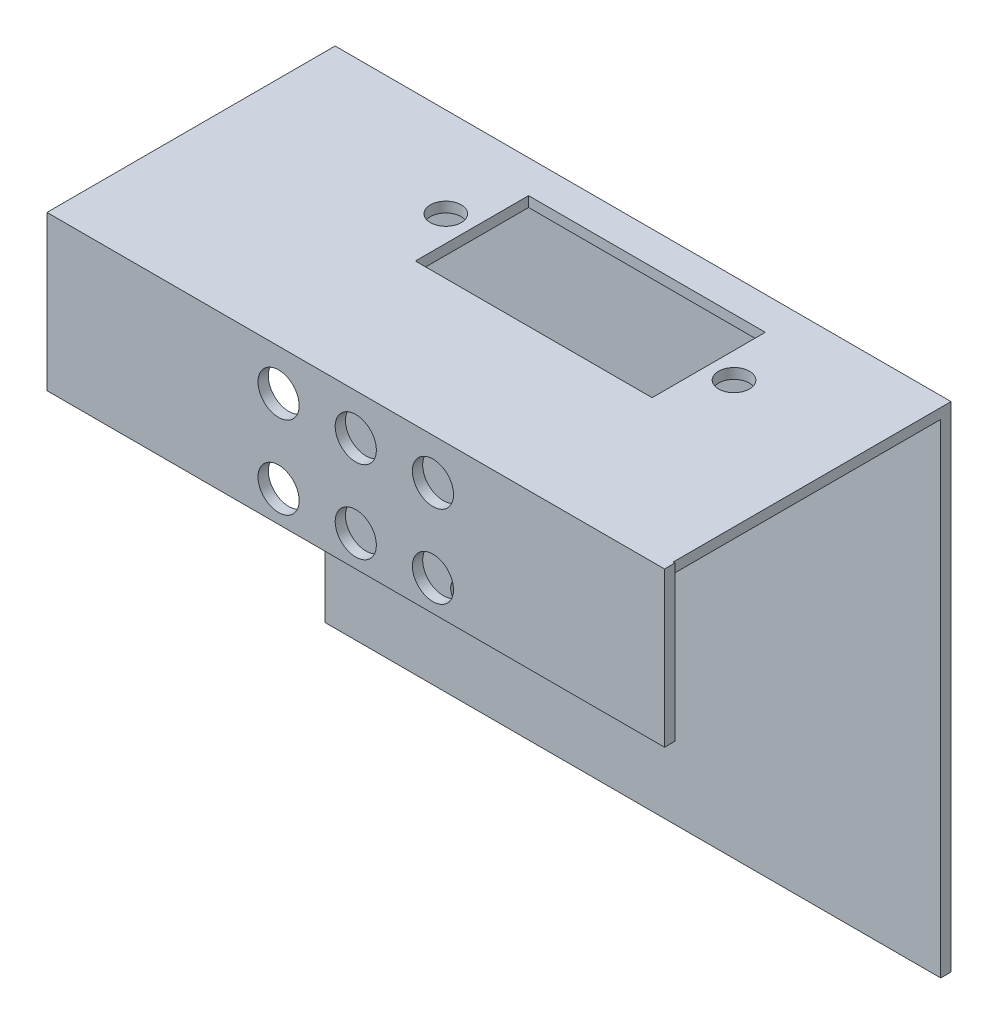
ISO-10303-21;
HEADER;
FILE_DESCRIPTION(('STEP AP214'),'2;1');
FILE_NAME('part.step','',(''),(''),'','','');
FILE_SCHEMA(('AUTOMOTIVE_DESIGN { 1 0 10303 214 1 1 1 1 }'));
ENDSEC;
DATA;
#1=APPLICATION_CONTEXT('core data for automotive mechanical design processes');
#2=APPLICATION_PROTOCOL_DEFINITION('international standard','automotive_design',2000,#1);
#3=PRODUCT_CONTEXT('',#1,'mechanical');
#4=PRODUCT('Part','Part','',(#3));
#5=PRODUCT_RELATED_PRODUCT_CATEGORY('part','',(#4));
#6=PRODUCT_DEFINITION_FORMATION('','',#4);
#7=PRODUCT_DEFINITION_CONTEXT('part definition',#1,'design');
#8=PRODUCT_DEFINITION('design','',#6,#7);
#9=PRODUCT_DEFINITION_SHAPE('','',#8);
#10=(LENGTH_UNIT() NAMED_UNIT(*) SI_UNIT(.MILLI.,.METRE.));
#11=(NAMED_UNIT(*) PLANE_ANGLE_UNIT() SI_UNIT($,.RADIAN.));
#12=(NAMED_UNIT(*) SI_UNIT($,.STERADIAN.) SOLID_ANGLE_UNIT());
#13=UNCERTAINTY_MEASURE_WITH_UNIT(LENGTH_MEASURE(1.E-05),#10,'distance_accuracy_value','');
#14=(GEOMETRIC_REPRESENTATION_CONTEXT(3) GLOBAL_UNCERTAINTY_ASSIGNED_CONTEXT((#13)) GLOBAL_UNIT_ASSIGNED_CONTEXT((#10,
#11,#12)) REPRESENTATION_CONTEXT('',''));
#15=CARTESIAN_POINT('',(0.,0.,0.));
#16=DIRECTION('',(0.,0.,1.));
#17=DIRECTION('',(1.,0.,0.));
#18=AXIS2_PLACEMENT_3D('',#15,#16,#17);
#19=CARTESIAN_POINT('',(0.,0.,0.));
#20=DIRECTION('',(0.,0.,-1.));
#21=DIRECTION('',(-1.,0.,0.));
#22=AXIS2_PLACEMENT_3D('',#19,#20,#21);
#23=PLANE('',#22);
#24=CARTESIAN_POINT('',(0.,-4.50000000000001,0.));
#25=DIRECTION('',(0.,0.,-1.));
#26=DIRECTION('',(-1.,0.,0.));
#27=AXIS2_PLACEMENT_3D('',#24,#25,#26);
#28=CIRCLE('',#27,2.);
#29=CARTESIAN_POINT('',(-1.99999999999998,-4.50000000000001,0.));
#30=VERTEX_POINT('',#29);
#31=EDGE_CURVE('E208',#30,#30,#28,.T.);
#32=ORIENTED_EDGE('',*,*,#31,.F.);
#33=EDGE_LOOP('',(#32));
#34=FACE_BOUND('',#33,.T.);
#35=DIRECTION('',(0.,-1.,0.));
#36=VECTOR('',#35,1.);
#37=CARTESIAN_POINT('',(-30.,7.49999999999998,0.));
#38=LINE('',#37,#36);
#39=CARTESIAN_POINT('',(-30.,6.5,0.));
#40=VERTEX_POINT('',#39);
#41=CARTESIAN_POINT('',(-30.,-7.50000000000001,0.));
#42=VERTEX_POINT('',#41);
#43=EDGE_CURVE('E260',#40,#42,#38,.T.);
#44=ORIENTED_EDGE('',*,*,#43,.F.);
#45=DIRECTION('',(1.,0.,0.));
#46=VECTOR('',#45,1.);
#47=CARTESIAN_POINT('',(-30.0040434778772,6.5,0.));
#48=LINE('',#47,#46);
#49=CARTESIAN_POINT('',(29.8328247305026,6.5,0.));
#50=VERTEX_POINT('',#49);
#51=EDGE_CURVE('E11',#40,#50,#48,.T.);
#52=ORIENTED_EDGE('',*,*,#51,.T.);
#53=DIRECTION('',(0.,1.,0.));
#54=VECTOR('',#53,1.);
#55=CARTESIAN_POINT('',(29.8328247305026,6.5,0.));
#56=LINE('',#55,#54);
#57=CARTESIAN_POINT('',(29.8328247305026,7.5,0.));
#58=VERTEX_POINT('',#57);
#59=EDGE_CURVE('E247',#50,#58,#56,.T.);
#60=ORIENTED_EDGE('',*,*,#59,.T.);
#61=DIRECTION('',(-1.,0.,0.));
#62=VECTOR('',#61,1.);
#63=CARTESIAN_POINT('',(30.,7.5,0.));
#64=LINE('',#63,#62);
#65=CARTESIAN_POINT('',(30.,7.5,0.));
#66=VERTEX_POINT('',#65);
#67=EDGE_CURVE('E271',#66,#58,#64,.T.);
#68=ORIENTED_EDGE('',*,*,#67,.F.);
#69=DIRECTION('',(0.,1.,0.));
#70=VECTOR('',#69,1.);
#71=CARTESIAN_POINT('',(30.,7.5,0.));
#72=LINE('',#71,#70);
#73=CARTESIAN_POINT('',(30.,-7.5,0.));
#74=VERTEX_POINT('',#73);
#75=EDGE_CURVE('E283',#74,#66,#72,.T.);
#76=ORIENTED_EDGE('',*,*,#75,.F.);
#77=DIRECTION('',(1.,0.,0.));
#78=VECTOR('',#77,1.);
#79=CARTESIAN_POINT('',(30.,-7.5,0.));
#80=LINE('',#79,#78);
#81=EDGE_CURVE('E281',#42,#74,#80,.T.);
#82=ORIENTED_EDGE('',*,*,#81,.F.);
#83=EDGE_LOOP('',(#44,#52,#60,#68,#76,#82));
#84=FACE_BOUND('',#83,.T.);
#85=CARTESIAN_POINT('',(-7.49999999999998,3.50000000000001,0.));
#86=DIRECTION('',(0.,0.,1.));
#87=DIRECTION('',(1.,0.,0.));
#88=AXIS2_PLACEMENT_3D('',#85,#86,#87);
#89=CIRCLE('',#88,2.);
#90=CARTESIAN_POINT('',(-5.49999999999998,3.50000000000001,0.));
#91=VERTEX_POINT('',#90);
#92=EDGE_CURVE('E216',#91,#91,#89,.T.);
#93=ORIENTED_EDGE('',*,*,#92,.T.);
#94=EDGE_LOOP('',(#93));
#95=FACE_BOUND('',#94,.T.);
#96=CARTESIAN_POINT('',(0.,3.50000000000001,0.));
#97=DIRECTION('',(0.,0.,1.));
#98=DIRECTION('',(1.,0.,0.));
#99=AXIS2_PLACEMENT_3D('',#96,#97,#98);
#100=CIRCLE('',#99,2.);
#101=CARTESIAN_POINT('',(2.00000000000002,3.50000000000001,0.));
#102=VERTEX_POINT('',#101);
#103=EDGE_CURVE('E190',#102,#102,#100,.T.);
#104=ORIENTED_EDGE('',*,*,#103,.T.);
#105=EDGE_LOOP('',(#104));
#106=FACE_BOUND('',#105,.T.);
#107=CARTESIAN_POINT('',(7.49999999999997,3.50000000000001,0.));
#108=DIRECTION('',(0.,0.,1.));
#109=DIRECTION('',(1.,0.,0.));
#110=AXIS2_PLACEMENT_3D('',#107,#108,#109);
#111=CIRCLE('',#110,2.);
#112=CARTESIAN_POINT('',(9.49999999999997,3.50000000000001,0.));
#113=VERTEX_POINT('',#112);
#114=EDGE_CURVE('E196',#113,#113,#111,.T.);
#115=ORIENTED_EDGE('',*,*,#114,.T.);
#116=EDGE_LOOP('',(#115));
#117=FACE_BOUND('',#116,.T.);
#118=CARTESIAN_POINT('',(7.49999999999997,-4.50000000000001,0.));
#119=DIRECTION('',(0.,0.,-1.));
#120=DIRECTION('',(-1.,0.,0.));
#121=AXIS2_PLACEMENT_3D('',#118,#119,#120);
#122=CIRCLE('',#121,2.);
#123=CARTESIAN_POINT('',(5.49999999999997,-4.50000000000001,0.));
#124=VERTEX_POINT('',#123);
#125=EDGE_CURVE('E202',#124,#124,#122,.T.);
#126=ORIENTED_EDGE('',*,*,#125,.F.);
#127=EDGE_LOOP('',(#126));
#128=FACE_BOUND('',#127,.T.);
#129=CARTESIAN_POINT('',(-7.49999999999998,-4.50000000000001,0.));
#130=DIRECTION('',(0.,0.,-1.));
#131=DIRECTION('',(-1.,0.,0.));
#132=AXIS2_PLACEMENT_3D('',#129,#130,#131);
#133=CIRCLE('',#132,2.);
#134=CARTESIAN_POINT('',(-9.49999999999998,-4.50000000000001,0.));
#135=VERTEX_POINT('',#134);
#136=EDGE_CURVE('E182',#135,#135,#133,.T.);
#137=ORIENTED_EDGE('',*,*,#136,.F.);
#138=EDGE_LOOP('',(#137));
#139=FACE_BOUND('',#138,.T.);
#140=ADVANCED_FACE('F39',(#34,#84,#95,#106,#117,#128,#139),#23,.T.);
#141=CARTESIAN_POINT('',(0.,0.,1.));
#142=DIRECTION('',(0.,0.,-1.));
#143=DIRECTION('',(-1.,0.,0.));
#144=AXIS2_PLACEMENT_3D('',#141,#142,#143);
#145=PLANE('',#144);
#146=CARTESIAN_POINT('',(7.49999999999997,3.50000000000001,1.));
#147=DIRECTION('',(0.,0.,1.));
#148=DIRECTION('',(1.,0.,0.));
#149=AXIS2_PLACEMENT_3D('',#146,#147,#148);
#150=CIRCLE('',#149,2.);
#151=CARTESIAN_POINT('',(9.49999999999997,3.50000000000001,1.));
#152=VERTEX_POINT('',#151);
#153=EDGE_CURVE('E193',#152,#152,#150,.T.);
#154=ORIENTED_EDGE('',*,*,#153,.F.);
#155=EDGE_LOOP('',(#154));
#156=FACE_BOUND('',#155,.T.);
#157=CARTESIAN_POINT('',(0.,3.50000000000001,1.));
#158=DIRECTION('',(0.,0.,1.));
#159=DIRECTION('',(1.,0.,0.));
#160=AXIS2_PLACEMENT_3D('',#157,#158,#159);
#161=CIRCLE('',#160,2.);
#162=CARTESIAN_POINT('',(2.00000000000002,3.50000000000001,1.));
#163=VERTEX_POINT('',#162);
#164=EDGE_CURVE('E186',#163,#163,#161,.T.);
#165=ORIENTED_EDGE('',*,*,#164,.F.);
#166=EDGE_LOOP('',(#165));
#167=FACE_BOUND('',#166,.T.);
#168=CARTESIAN_POINT('',(-7.49999999999998,3.50000000000001,1.));
#169=DIRECTION('',(0.,0.,1.));
#170=DIRECTION('',(1.,0.,0.));
#171=AXIS2_PLACEMENT_3D('',#168,#169,#170);
#172=CIRCLE('',#171,2.);
#173=CARTESIAN_POINT('',(-5.49999999999998,3.50000000000001,1.));
#174=VERTEX_POINT('',#173);
#175=EDGE_CURVE('E189',#174,#174,#172,.T.);
#176=ORIENTED_EDGE('',*,*,#175,.F.);
#177=EDGE_LOOP('',(#176));
#178=FACE_BOUND('',#177,.T.);
#179=DIRECTION('',(0.,-1.,0.));
#180=VECTOR('',#179,1.);
#181=CARTESIAN_POINT('',(-30.,7.49999999999998,1.));
#182=LINE('',#181,#180);
#183=CARTESIAN_POINT('',(-30.,7.49999999999998,1.));
#184=VERTEX_POINT('',#183);
#185=CARTESIAN_POINT('',(-30.,-7.50000000000001,1.));
#186=VERTEX_POINT('',#185);
#187=EDGE_CURVE('E267',#184,#186,#182,.T.);
#188=ORIENTED_EDGE('',*,*,#187,.T.);
#189=DIRECTION('',(1.,0.,0.));
#190=VECTOR('',#189,1.);
#191=CARTESIAN_POINT('',(30.,-7.5,1.));
#192=LINE('',#191,#190);
#193=CARTESIAN_POINT('',(30.,-7.5,1.));
#194=VERTEX_POINT('',#193);
#195=EDGE_CURVE('E270',#186,#194,#192,.T.);
#196=ORIENTED_EDGE('',*,*,#195,.T.);
#197=DIRECTION('',(0.,1.,0.));
#198=VECTOR('',#197,1.);
#199=CARTESIAN_POINT('',(30.,7.5,1.));
#200=LINE('',#199,#198);
#201=CARTESIAN_POINT('',(30.,7.5,1.));
#202=VERTEX_POINT('',#201);
#203=EDGE_CURVE('E273',#194,#202,#200,.T.);
#204=ORIENTED_EDGE('',*,*,#203,.T.);
#205=DIRECTION('',(-1.,0.,0.));
#206=VECTOR('',#205,1.);
#207=CARTESIAN_POINT('',(30.,7.5,1.));
#208=LINE('',#207,#206);
#209=EDGE_CURVE('E275',#202,#184,#208,.T.);
#210=ORIENTED_EDGE('',*,*,#209,.T.);
#211=EDGE_LOOP('',(#188,#196,#204,#210));
#212=FACE_BOUND('',#211,.T.);
#213=CARTESIAN_POINT('',(7.49999999999997,-4.50000000000001,1.));
#214=DIRECTION('',(0.,0.,-1.));
#215=DIRECTION('',(-1.,0.,0.));
#216=AXIS2_PLACEMENT_3D('',#213,#214,#215);
#217=CIRCLE('',#216,2.);
#218=CARTESIAN_POINT('',(5.49999999999997,-4.50000000000001,1.));
#219=VERTEX_POINT('',#218);
#220=EDGE_CURVE('E199',#219,#219,#217,.T.);
#221=ORIENTED_EDGE('',*,*,#220,.T.);
#222=EDGE_LOOP('',(#221));
#223=FACE_BOUND('',#222,.T.);
#224=CARTESIAN_POINT('',(0.,-4.50000000000001,1.));
#225=DIRECTION('',(0.,0.,-1.));
#226=DIRECTION('',(-1.,0.,0.));
#227=AXIS2_PLACEMENT_3D('',#224,#225,#226);
#228=CIRCLE('',#227,2.);
#229=CARTESIAN_POINT('',(-1.99999999999998,-4.50000000000001,1.));
#230=VERTEX_POINT('',#229);
#231=EDGE_CURVE('E205',#230,#230,#228,.T.);
#232=ORIENTED_EDGE('',*,*,#231,.T.);
#233=EDGE_LOOP('',(#232));
#234=FACE_BOUND('',#233,.T.);
#235=CARTESIAN_POINT('',(-7.49999999999998,-4.50000000000001,1.));
#236=DIRECTION('',(0.,0.,-1.));
#237=DIRECTION('',(-1.,0.,0.));
#238=AXIS2_PLACEMENT_3D('',#235,#236,#237);
#239=CIRCLE('',#238,2.);
#240=CARTESIAN_POINT('',(-9.49999999999998,-4.50000000000001,1.));
#241=VERTEX_POINT('',#240);
#242=EDGE_CURVE('E211',#241,#241,#239,.T.);
#243=ORIENTED_EDGE('',*,*,#242,.T.);
#244=EDGE_LOOP('',(#243));
#245=FACE_BOUND('',#244,.T.);
#246=ADVANCED_FACE('F315',(#156,#167,#178,#212,#223,#234,#245),#145,.F.);
#247=CARTESIAN_POINT('',(0.,6.5,0.));
#248=DIRECTION('',(0.,-1.,0.));
#249=DIRECTION('',(0.,0.,-1.));
#250=AXIS2_PLACEMENT_3D('',#247,#248,#249);
#251=PLANE('',#250);
#252=CARTESIAN_POINT('',(17.4840767670372,6.49999999999999,-18.2649709182265));
#253=DIRECTION('',(0.,1.,0.));
#254=DIRECTION('',(-1.,0.,0.));
#255=AXIS2_PLACEMENT_3D('',#252,#253,#254);
#256=CIRCLE('',#255,1.5);
#257=CARTESIAN_POINT('',(15.9840767670372,6.49999999999999,-18.2649709182265));
#258=VERTEX_POINT('',#257);
#259=EDGE_CURVE('E176',#258,#258,#256,.T.);
#260=ORIENTED_EDGE('',*,*,#259,.T.);
#261=EDGE_LOOP('',(#260));
#262=FACE_BOUND('',#261,.T.);
#263=CARTESIAN_POINT('',(-10.5159232329628,6.49999999999999,-18.2649709182265));
#264=DIRECTION('',(0.,1.,0.));
#265=DIRECTION('',(-1.,0.,0.));
#266=AXIS2_PLACEMENT_3D('',#263,#264,#265);
#267=CIRCLE('',#266,1.5);
#268=CARTESIAN_POINT('',(-12.0159232329628,6.49999999999999,-18.2649709182265));
#269=VERTEX_POINT('',#268);
#270=EDGE_CURVE('E169',#269,#269,#267,.T.);
#271=ORIENTED_EDGE('',*,*,#270,.T.);
#272=EDGE_LOOP('',(#271));
#273=FACE_BOUND('',#272,.T.);
#274=DIRECTION('',(0.,0.,-1.));
#275=VECTOR('',#274,1.);
#276=CARTESIAN_POINT('',(14.9840767670372,6.49999999999999,-23.8074479574089));
#277=LINE('',#276,#275);
#278=CARTESIAN_POINT('',(14.9840767670372,6.49999999999999,-12.8074479574089));
#279=VERTEX_POINT('',#278);
#280=CARTESIAN_POINT('',(14.9840767670372,6.49999999999999,-23.8074479574089));
#281=VERTEX_POINT('',#280);
#282=EDGE_CURVE('E147',#279,#281,#277,.T.);
#283=ORIENTED_EDGE('',*,*,#282,.T.);
#284=DIRECTION('',(-1.,0.,0.));
#285=VECTOR('',#284,1.);
#286=CARTESIAN_POINT('',(-8.01592323296278,6.49999999999999,-23.8074479574089));
#287=LINE('',#286,#285);
#288=CARTESIAN_POINT('',(-8.01592323296278,6.5,-23.8074479574089));
#289=VERTEX_POINT('',#288);
#290=EDGE_CURVE('E156',#281,#289,#287,.T.);
#291=ORIENTED_EDGE('',*,*,#290,.T.);
#292=DIRECTION('',(0.,0.,1.));
#293=VECTOR('',#292,1.);
#294=CARTESIAN_POINT('',(-8.01592323296278,6.49999999999999,-23.8074479574089));
#295=LINE('',#294,#293);
#296=CARTESIAN_POINT('',(-8.01592323296278,6.49999999999999,-12.8074479574089));
#297=VERTEX_POINT('',#296);
#298=EDGE_CURVE('E56',#289,#297,#295,.T.);
#299=ORIENTED_EDGE('',*,*,#298,.T.);
#300=DIRECTION('',(1.,0.,0.));
#301=VECTOR('',#300,1.);
#302=CARTESIAN_POINT('',(-8.01592323296278,6.49999999999999,-12.8074479574089));
#303=LINE('',#302,#301);
#304=EDGE_CURVE('E153',#297,#279,#303,.T.);
#305=ORIENTED_EDGE('',*,*,#304,.T.);
#306=EDGE_LOOP('',(#283,#291,#299,#305));
#307=FACE_BOUND('',#306,.T.);
#308=DIRECTION('',(0.,0.,1.));
#309=VECTOR('',#308,1.);
#310=CARTESIAN_POINT('',(-30.0040434778772,6.5,0.));
#311=LINE('',#310,#309);
#312=CARTESIAN_POINT('',(-30.0040434778772,6.5,-26.));
#313=VERTEX_POINT('',#312);
#314=CARTESIAN_POINT('',(-30.0040434778772,6.5,0.));
#315=VERTEX_POINT('',#314);
#316=EDGE_CURVE('E245',#313,#315,#311,.T.);
#317=ORIENTED_EDGE('',*,*,#316,.F.);
#318=DIRECTION('',(-1.,0.,0.));
#319=VECTOR('',#318,1.);
#320=CARTESIAN_POINT('',(29.8328247305026,6.5,-26.));
#321=LINE('',#320,#319);
#322=CARTESIAN_POINT('',(29.8328247305026,6.5,-26.));
#323=VERTEX_POINT('',#322);
#324=EDGE_CURVE('E222',#323,#313,#321,.T.);
#325=ORIENTED_EDGE('',*,*,#324,.F.);
#326=DIRECTION('',(0.,0.,-1.));
#327=VECTOR('',#326,1.);
#328=CARTESIAN_POINT('',(29.8328247305026,6.5,-27.));
#329=LINE('',#328,#327);
#330=EDGE_CURVE('E241',#50,#323,#329,.T.);
#331=ORIENTED_EDGE('',*,*,#330,.F.);
#332=ORIENTED_EDGE('',*,*,#51,.F.);
#333=EDGE_CURVE('E49',#315,#40,#48,.T.);
#334=ORIENTED_EDGE('',*,*,#333,.F.);
#335=EDGE_LOOP('',(#317,#325,#331,#332,#334));
#336=FACE_BOUND('',#335,.T.);
#337=ADVANCED_FACE('F160',(#262,#273,#307,#336),#251,.T.);
#338=CARTESIAN_POINT('',(-30.,7.49999999999998,1.));
#339=DIRECTION('',(1.,0.,0.));
#340=DIRECTION('',(0.,1.,0.));
#341=AXIS2_PLACEMENT_3D('',#338,#339,#340);
#342=PLANE('',#341);
#343=CARTESIAN_POINT('',(-30.,7.5,0.));
#344=VERTEX_POINT('',#343);
#345=EDGE_CURVE('E278',#344,#40,#38,.T.);
#346=ORIENTED_EDGE('',*,*,#345,.T.);
#347=ORIENTED_EDGE('',*,*,#43,.T.);
#348=DIRECTION('',(0.,0.,-1.));
#349=VECTOR('',#348,1.);
#350=CARTESIAN_POINT('',(-30.,-7.50000000000001,1.));
#351=LINE('',#350,#349);
#352=EDGE_CURVE('E43',#186,#42,#351,.T.);
#353=ORIENTED_EDGE('',*,*,#352,.F.);
#354=ORIENTED_EDGE('',*,*,#187,.F.);
#355=DIRECTION('',(0.,0.,-1.));
#356=VECTOR('',#355,1.);
#357=CARTESIAN_POINT('',(-30.,7.49999999999998,1.));
#358=LINE('',#357,#356);
#359=EDGE_CURVE('E277',#184,#344,#358,.T.);
#360=ORIENTED_EDGE('',*,*,#359,.T.);
#361=EDGE_LOOP('',(#346,#347,#353,#354,#360));
#362=FACE_BOUND('',#361,.T.);
#363=ADVANCED_FACE('F41',(#362),#342,.F.);
#364=CARTESIAN_POINT('',(30.,-7.5,1.));
#365=DIRECTION('',(0.,1.,0.));
#366=DIRECTION('',(-1.,0.,0.));
#367=AXIS2_PLACEMENT_3D('',#364,#365,#366);
#368=PLANE('',#367);
#369=ORIENTED_EDGE('',*,*,#81,.T.);
#370=DIRECTION('',(0.,0.,-1.));
#371=VECTOR('',#370,1.);
#372=CARTESIAN_POINT('',(30.,-7.5,1.));
#373=LINE('',#372,#371);
#374=EDGE_CURVE('E291',#194,#74,#373,.T.);
#375=ORIENTED_EDGE('',*,*,#374,.F.);
#376=ORIENTED_EDGE('',*,*,#195,.F.);
#377=ORIENTED_EDGE('',*,*,#352,.T.);
#378=EDGE_LOOP('',(#369,#375,#376,#377));
#379=FACE_BOUND('',#378,.T.);
#380=ADVANCED_FACE('F300',(#379),#368,.F.);
#381=CARTESIAN_POINT('',(30.,7.5,1.));
#382=DIRECTION('',(-1.,0.,0.));
#383=DIRECTION('',(0.,-1.,0.));
#384=AXIS2_PLACEMENT_3D('',#381,#382,#383);
#385=PLANE('',#384);
#386=ORIENTED_EDGE('',*,*,#75,.T.);
#387=DIRECTION('',(0.,0.,-1.));
#388=VECTOR('',#387,1.);
#389=CARTESIAN_POINT('',(30.,7.5,1.));
#390=LINE('',#389,#388);
#391=EDGE_CURVE('E289',#202,#66,#390,.T.);
#392=ORIENTED_EDGE('',*,*,#391,.F.);
#393=ORIENTED_EDGE('',*,*,#203,.F.);
#394=ORIENTED_EDGE('',*,*,#374,.T.);
#395=EDGE_LOOP('',(#386,#392,#393,#394));
#396=FACE_BOUND('',#395,.T.);
#397=ADVANCED_FACE('F309',(#396),#385,.F.);
#398=CARTESIAN_POINT('',(30.,7.5,1.));
#399=DIRECTION('',(0.,-1.,0.));
#400=DIRECTION('',(1.,0.,0.));
#401=AXIS2_PLACEMENT_3D('',#398,#399,#400);
#402=PLANE('',#401);
#403=CARTESIAN_POINT('',(17.4840767670372,7.49999999999999,-18.2649709182265));
#404=DIRECTION('',(0.,1.,0.));
#405=DIRECTION('',(-1.,0.,0.));
#406=AXIS2_PLACEMENT_3D('',#403,#404,#405);
#407=CIRCLE('',#406,1.5);
#408=CARTESIAN_POINT('',(15.9840767670372,7.49999999999999,-18.2649709182265));
#409=VERTEX_POINT('',#408);
#410=EDGE_CURVE('E430',#409,#409,#407,.T.);
#411=ORIENTED_EDGE('',*,*,#410,.F.);
#412=EDGE_LOOP('',(#411));
#413=FACE_BOUND('',#412,.T.);
#414=CARTESIAN_POINT('',(-10.5159232329628,7.49999999999999,-18.2649709182265));
#415=DIRECTION('',(0.,1.,0.));
#416=DIRECTION('',(-1.,0.,0.));
#417=AXIS2_PLACEMENT_3D('',#414,#415,#416);
#418=CIRCLE('',#417,1.5);
#419=CARTESIAN_POINT('',(-12.0159232329628,7.49999999999999,-18.2649709182265));
#420=VERTEX_POINT('',#419);
#421=EDGE_CURVE('E432',#420,#420,#418,.T.);
#422=ORIENTED_EDGE('',*,*,#421,.F.);
#423=EDGE_LOOP('',(#422));
#424=FACE_BOUND('',#423,.T.);
#425=DIRECTION('',(-1.,0.,0.));
#426=VECTOR('',#425,1.);
#427=CARTESIAN_POINT('',(-8.01592323296278,7.49999999999999,-23.8074479574089));
#428=LINE('',#427,#426);
#429=CARTESIAN_POINT('',(14.9840767670372,7.49999999999999,-23.8074479574089));
#430=VERTEX_POINT('',#429);
#431=CARTESIAN_POINT('',(-8.01592323296278,7.49999999999999,-23.8074479574089));
#432=VERTEX_POINT('',#431);
#433=EDGE_CURVE('E175',#430,#432,#428,.T.);
#434=ORIENTED_EDGE('',*,*,#433,.F.);
#435=DIRECTION('',(0.,0.,-1.));
#436=VECTOR('',#435,1.);
#437=CARTESIAN_POINT('',(14.9840767670372,7.49999999999999,-23.8074479574089));
#438=LINE('',#437,#436);
#439=CARTESIAN_POINT('',(14.9840767670372,7.49999999999999,-12.8074479574089));
#440=VERTEX_POINT('',#439);
#441=EDGE_CURVE('E64',#440,#430,#438,.T.);
#442=ORIENTED_EDGE('',*,*,#441,.F.);
#443=DIRECTION('',(1.,0.,0.));
#444=VECTOR('',#443,1.);
#445=CARTESIAN_POINT('',(-8.01592323296278,7.49999999999999,-12.8074479574089));
#446=LINE('',#445,#444);
#447=CARTESIAN_POINT('',(-8.01592323296278,7.49999999999999,-12.8074479574089));
#448=VERTEX_POINT('',#447);
#449=EDGE_CURVE('E163',#448,#440,#446,.T.);
#450=ORIENTED_EDGE('',*,*,#449,.F.);
#451=DIRECTION('',(0.,0.,1.));
#452=VECTOR('',#451,1.);
#453=CARTESIAN_POINT('',(-8.01592323296278,7.49999999999999,-23.8074479574089));
#454=LINE('',#453,#452);
#455=EDGE_CURVE('E166',#432,#448,#454,.T.);
#456=ORIENTED_EDGE('',*,*,#455,.F.);
#457=EDGE_LOOP('',(#434,#442,#450,#456));
#458=FACE_BOUND('',#457,.T.);
#459=ORIENTED_EDGE('',*,*,#67,.T.);
#460=DIRECTION('',(0.,0.,-1.));
#461=VECTOR('',#460,1.);
#462=CARTESIAN_POINT('',(29.8328247305026,7.5,-27.));
#463=LINE('',#462,#461);
#464=CARTESIAN_POINT('',(29.8328247305026,7.5,-27.));
#465=VERTEX_POINT('',#464);
#466=EDGE_CURVE('E250',#58,#465,#463,.T.);
#467=ORIENTED_EDGE('',*,*,#466,.T.);
#468=DIRECTION('',(-1.,0.,0.));
#469=VECTOR('',#468,1.);
#470=CARTESIAN_POINT('',(-30.0040434778772,7.5,-27.));
#471=LINE('',#470,#469);
#472=CARTESIAN_POINT('',(-30.0040434778772,7.5,-27.));
#473=VERTEX_POINT('',#472);
#474=EDGE_CURVE('E253',#465,#473,#471,.T.);
#475=ORIENTED_EDGE('',*,*,#474,.T.);
#476=DIRECTION('',(0.,0.,1.));
#477=VECTOR('',#476,1.);
#478=CARTESIAN_POINT('',(-30.0040434778772,7.5,0.));
#479=LINE('',#478,#477);
#480=CARTESIAN_POINT('',(-30.0040434778772,7.5,0.));
#481=VERTEX_POINT('',#480);
#482=EDGE_CURVE('E242',#473,#481,#479,.T.);
#483=ORIENTED_EDGE('',*,*,#482,.T.);
#484=DIRECTION('',(1.,0.,0.));
#485=VECTOR('',#484,1.);
#486=CARTESIAN_POINT('',(-30.0040434778772,7.5,0.));
#487=LINE('',#486,#485);
#488=EDGE_CURVE('E238',#481,#344,#487,.T.);
#489=ORIENTED_EDGE('',*,*,#488,.T.);
#490=ORIENTED_EDGE('',*,*,#359,.F.);
#491=ORIENTED_EDGE('',*,*,#209,.F.);
#492=ORIENTED_EDGE('',*,*,#391,.T.);
#493=EDGE_LOOP('',(#459,#467,#475,#483,#489,#490,#491,#492));
#494=FACE_BOUND('',#493,.T.);
#495=ADVANCED_FACE('F312',(#413,#424,#458,#494),#402,.F.);
#496=CARTESIAN_POINT('',(-30.0040434778772,6.5,0.));
#497=DIRECTION('',(0.,0.,1.));
#498=DIRECTION('',(1.,0.,0.));
#499=AXIS2_PLACEMENT_3D('',#496,#497,#498);
#500=PLANE('',#499);
#501=ORIENTED_EDGE('',*,*,#345,.F.);
#502=ORIENTED_EDGE('',*,*,#488,.F.);
#503=DIRECTION('',(0.,1.,0.));
#504=VECTOR('',#503,1.);
#505=CARTESIAN_POINT('',(-30.0040434778772,6.5,0.));
#506=LINE('',#505,#504);
#507=EDGE_CURVE('E258',#315,#481,#506,.T.);
#508=ORIENTED_EDGE('',*,*,#507,.F.);
#509=ORIENTED_EDGE('',*,*,#333,.T.);
#510=EDGE_LOOP('',(#501,#502,#508,#509));
#511=FACE_BOUND('',#510,.T.);
#512=ADVANCED_FACE('F352',(#511),#500,.T.);
#513=CARTESIAN_POINT('',(-30.0040434778772,6.5,0.));
#514=DIRECTION('',(-1.,0.,0.));
#515=DIRECTION('',(0.,0.,1.));
#516=AXIS2_PLACEMENT_3D('',#513,#514,#515);
#517=PLANE('',#516);
#518=ORIENTED_EDGE('',*,*,#482,.F.);
#519=DIRECTION('',(0.,1.,0.));
#520=VECTOR('',#519,1.);
#521=CARTESIAN_POINT('',(-30.0040434778772,6.5,-27.));
#522=LINE('',#521,#520);
#523=CARTESIAN_POINT('',(-30.0040434778772,-40.5,-27.));
#524=VERTEX_POINT('',#523);
#525=EDGE_CURVE('E261',#524,#473,#522,.T.);
#526=ORIENTED_EDGE('',*,*,#525,.F.);
#527=DIRECTION('',(0.,0.,-1.));
#528=VECTOR('',#527,1.);
#529=CARTESIAN_POINT('',(-30.0040434778772,-40.5,-26.));
#530=LINE('',#529,#528);
#531=CARTESIAN_POINT('',(-30.0040434778772,-40.5,-26.));
#532=VERTEX_POINT('',#531);
#533=EDGE_CURVE('E236',#532,#524,#530,.T.);
#534=ORIENTED_EDGE('',*,*,#533,.F.);
#535=DIRECTION('',(0.,-1.,0.));
#536=VECTOR('',#535,1.);
#537=CARTESIAN_POINT('',(-30.0040434778772,-40.5,-26.));
#538=LINE('',#537,#536);
#539=EDGE_CURVE('E225',#313,#532,#538,.T.);
#540=ORIENTED_EDGE('',*,*,#539,.F.);
#541=ORIENTED_EDGE('',*,*,#316,.T.);
#542=ORIENTED_EDGE('',*,*,#507,.T.);
#543=EDGE_LOOP('',(#518,#526,#534,#540,#541,#542));
#544=FACE_BOUND('',#543,.T.);
#545=ADVANCED_FACE('F374',(#544),#517,.T.);
#546=CARTESIAN_POINT('',(-30.0040434778772,6.5,-27.));
#547=DIRECTION('',(0.,0.,-1.));
#548=DIRECTION('',(-1.,0.,0.));
#549=AXIS2_PLACEMENT_3D('',#546,#547,#548);
#550=PLANE('',#549);
#551=CARTESIAN_POINT('',(-16.5282621258098,-31.4906743408941,-27.));
#552=DIRECTION('',(0.,0.,-1.));
#553=DIRECTION('',(-1.,0.,0.));
#554=AXIS2_PLACEMENT_3D('',#551,#552,#553);
#555=CIRCLE('',#554,1.25);
#556=CARTESIAN_POINT('',(-17.7782621258098,-31.4906743408941,-27.));
#557=VERTEX_POINT('',#556);
#558=EDGE_CURVE('E425',#557,#557,#555,.T.);
#559=ORIENTED_EDGE('',*,*,#558,.F.);
#560=EDGE_LOOP('',(#559));
#561=FACE_BOUND('',#560,.T.);
#562=CARTESIAN_POINT('',(-16.0743277434718,-9.99546688489288,-27.));
#563=DIRECTION('',(0.,0.,-1.));
#564=DIRECTION('',(-1.,0.,0.));
#565=AXIS2_PLACEMENT_3D('',#562,#563,#564);
#566=CIRCLE('',#565,1.25);
#567=CARTESIAN_POINT('',(-17.3243277434718,-9.99546688489288,-27.));
#568=VERTEX_POINT('',#567);
#569=EDGE_CURVE('E422',#568,#568,#566,.T.);
#570=ORIENTED_EDGE('',*,*,#569,.F.);
#571=EDGE_LOOP('',(#570));
#572=FACE_BOUND('',#571,.T.);
#573=ORIENTED_EDGE('',*,*,#474,.F.);
#574=DIRECTION('',(0.,1.,0.));
#575=VECTOR('',#574,1.);
#576=CARTESIAN_POINT('',(29.8328247305026,6.5,-27.));
#577=LINE('',#576,#575);
#578=CARTESIAN_POINT('',(29.8328247305026,-40.5,-27.));
#579=VERTEX_POINT('',#578);
#580=EDGE_CURVE('E263',#579,#465,#577,.T.);
#581=ORIENTED_EDGE('',*,*,#580,.F.);
#582=DIRECTION('',(1.,0.,0.));
#583=VECTOR('',#582,1.);
#584=CARTESIAN_POINT('',(29.8328247305026,-40.5,-27.));
#585=LINE('',#584,#583);
#586=EDGE_CURVE('E219',#524,#579,#585,.T.);
#587=ORIENTED_EDGE('',*,*,#586,.F.);
#588=ORIENTED_EDGE('',*,*,#525,.T.);
#589=EDGE_LOOP('',(#573,#581,#587,#588));
#590=FACE_BOUND('',#589,.T.);
#591=ADVANCED_FACE('F377',(#561,#572,#590),#550,.T.);
#592=CARTESIAN_POINT('',(29.8328247305026,6.5,-27.));
#593=DIRECTION('',(1.,0.,0.));
#594=DIRECTION('',(0.,0.,-1.));
#595=AXIS2_PLACEMENT_3D('',#592,#593,#594);
#596=PLANE('',#595);
#597=ORIENTED_EDGE('',*,*,#466,.F.);
#598=ORIENTED_EDGE('',*,*,#59,.F.);
#599=ORIENTED_EDGE('',*,*,#330,.T.);
#600=DIRECTION('',(0.,1.,0.));
#601=VECTOR('',#600,1.);
#602=CARTESIAN_POINT('',(29.8328247305026,6.5,-26.));
#603=LINE('',#602,#601);
#604=CARTESIAN_POINT('',(29.8328247305026,-40.5,-26.));
#605=VERTEX_POINT('',#604);
#606=EDGE_CURVE('E229',#605,#323,#603,.T.);
#607=ORIENTED_EDGE('',*,*,#606,.F.);
#608=DIRECTION('',(0.,0.,-1.));
#609=VECTOR('',#608,1.);
#610=CARTESIAN_POINT('',(29.8328247305026,-40.5,-26.));
#611=LINE('',#610,#609);
#612=EDGE_CURVE('E231',#605,#579,#611,.T.);
#613=ORIENTED_EDGE('',*,*,#612,.T.);
#614=ORIENTED_EDGE('',*,*,#580,.T.);
#615=EDGE_LOOP('',(#597,#598,#599,#607,#613,#614));
#616=FACE_BOUND('',#615,.T.);
#617=ADVANCED_FACE('F381',(#616),#596,.T.);
#618=CARTESIAN_POINT('',(29.8328247305026,-40.5,-26.));
#619=DIRECTION('',(0.,1.,0.));
#620=DIRECTION('',(-1.,0.,0.));
#621=AXIS2_PLACEMENT_3D('',#618,#619,#620);
#622=PLANE('',#621);
#623=ORIENTED_EDGE('',*,*,#586,.T.);
#624=ORIENTED_EDGE('',*,*,#612,.F.);
#625=DIRECTION('',(1.,0.,0.));
#626=VECTOR('',#625,1.);
#627=CARTESIAN_POINT('',(29.8328247305026,-40.5,-26.));
#628=LINE('',#627,#626);
#629=EDGE_CURVE('E227',#532,#605,#628,.T.);
#630=ORIENTED_EDGE('',*,*,#629,.F.);
#631=ORIENTED_EDGE('',*,*,#533,.T.);
#632=EDGE_LOOP('',(#623,#624,#630,#631));
#633=FACE_BOUND('',#632,.T.);
#634=ADVANCED_FACE('F372',(#633),#622,.F.);
#635=CARTESIAN_POINT('',(0.,0.,-26.));
#636=DIRECTION('',(0.,0.,-1.));
#637=DIRECTION('',(-1.,0.,0.));
#638=AXIS2_PLACEMENT_3D('',#635,#636,#637);
#639=PLANE('',#638);
#640=CARTESIAN_POINT('',(-16.5282621258098,-31.4906743408941,-26.));
#641=DIRECTION('',(0.,0.,-1.));
#642=DIRECTION('',(-1.,0.,0.));
#643=AXIS2_PLACEMENT_3D('',#640,#641,#642);
#644=CIRCLE('',#643,1.25);
#645=CARTESIAN_POINT('',(-17.7782621258098,-31.4906743408941,-26.));
#646=VERTEX_POINT('',#645);
#647=EDGE_CURVE('E417',#646,#646,#644,.T.);
#648=ORIENTED_EDGE('',*,*,#647,.T.);
#649=EDGE_LOOP('',(#648));
#650=FACE_BOUND('',#649,.T.);
#651=CARTESIAN_POINT('',(-16.0743277434718,-9.99546688489288,-26.));
#652=DIRECTION('',(0.,0.,-1.));
#653=DIRECTION('',(-1.,0.,0.));
#654=AXIS2_PLACEMENT_3D('',#651,#652,#653);
#655=CIRCLE('',#654,1.25);
#656=CARTESIAN_POINT('',(-17.3243277434718,-9.99546688489288,-26.));
#657=VERTEX_POINT('',#656);
#658=EDGE_CURVE('E420',#657,#657,#655,.T.);
#659=ORIENTED_EDGE('',*,*,#658,.T.);
#660=EDGE_LOOP('',(#659));
#661=FACE_BOUND('',#660,.T.);
#662=ORIENTED_EDGE('',*,*,#324,.T.);
#663=ORIENTED_EDGE('',*,*,#539,.T.);
#664=ORIENTED_EDGE('',*,*,#629,.T.);
#665=ORIENTED_EDGE('',*,*,#606,.T.);
#666=EDGE_LOOP('',(#662,#663,#664,#665));
#667=FACE_BOUND('',#666,.T.);
#668=ADVANCED_FACE('F404',(#650,#661,#667),#639,.F.);
#669=CARTESIAN_POINT('',(-7.49999999999998,3.50000000000001,0.));
#670=DIRECTION('',(0.,0.,1.));
#671=DIRECTION('',(1.,0.,0.));
#672=AXIS2_PLACEMENT_3D('',#669,#670,#671);
#673=CYLINDRICAL_SURFACE('',#672,2.);
#674=ORIENTED_EDGE('',*,*,#92,.F.);
#675=EDGE_LOOP('',(#674));
#676=FACE_BOUND('',#675,.T.);
#677=ORIENTED_EDGE('',*,*,#175,.T.);
#678=EDGE_LOOP('',(#677));
#679=FACE_BOUND('',#678,.T.);
#680=ADVANCED_FACE('F406',(#676,#679),#673,.F.);
#681=CARTESIAN_POINT('',(0.,3.50000000000001,0.));
#682=DIRECTION('',(0.,0.,1.));
#683=DIRECTION('',(1.,0.,0.));
#684=AXIS2_PLACEMENT_3D('',#681,#682,#683);
#685=CYLINDRICAL_SURFACE('',#684,2.);
#686=ORIENTED_EDGE('',*,*,#103,.F.);
#687=EDGE_LOOP('',(#686));
#688=FACE_BOUND('',#687,.T.);
#689=ORIENTED_EDGE('',*,*,#164,.T.);
#690=EDGE_LOOP('',(#689));
#691=FACE_BOUND('',#690,.T.);
#692=ADVANCED_FACE('F412',(#688,#691),#685,.F.);
#693=CARTESIAN_POINT('',(7.49999999999997,3.50000000000001,0.));
#694=DIRECTION('',(0.,0.,1.));
#695=DIRECTION('',(1.,0.,0.));
#696=AXIS2_PLACEMENT_3D('',#693,#694,#695);
#697=CYLINDRICAL_SURFACE('',#696,2.);
#698=ORIENTED_EDGE('',*,*,#114,.F.);
#699=EDGE_LOOP('',(#698));
#700=FACE_BOUND('',#699,.T.);
#701=ORIENTED_EDGE('',*,*,#153,.T.);
#702=EDGE_LOOP('',(#701));
#703=FACE_BOUND('',#702,.T.);
#704=ADVANCED_FACE('F471',(#700,#703),#697,.F.);
#705=CARTESIAN_POINT('',(7.49999999999997,-4.50000000000001,0.));
#706=DIRECTION('',(0.,0.,1.));
#707=DIRECTION('',(1.,0.,0.));
#708=AXIS2_PLACEMENT_3D('',#705,#706,#707);
#709=CYLINDRICAL_SURFACE('',#708,2.);
#710=ORIENTED_EDGE('',*,*,#125,.T.);
#711=EDGE_LOOP('',(#710));
#712=FACE_BOUND('',#711,.T.);
#713=ORIENTED_EDGE('',*,*,#220,.F.);
#714=EDGE_LOOP('',(#713));
#715=FACE_BOUND('',#714,.T.);
#716=ADVANCED_FACE('F337',(#712,#715),#709,.F.);
#717=CARTESIAN_POINT('',(0.,-4.50000000000001,0.));
#718=DIRECTION('',(0.,0.,1.));
#719=DIRECTION('',(1.,0.,0.));
#720=AXIS2_PLACEMENT_3D('',#717,#718,#719);
#721=CYLINDRICAL_SURFACE('',#720,2.);
#722=ORIENTED_EDGE('',*,*,#31,.T.);
#723=EDGE_LOOP('',(#722));
#724=FACE_BOUND('',#723,.T.);
#725=ORIENTED_EDGE('',*,*,#231,.F.);
#726=EDGE_LOOP('',(#725));
#727=FACE_BOUND('',#726,.T.);
#728=ADVANCED_FACE('F328',(#724,#727),#721,.F.);
#729=CARTESIAN_POINT('',(-7.49999999999998,-4.50000000000001,0.));
#730=DIRECTION('',(0.,0.,1.));
#731=DIRECTION('',(1.,0.,0.));
#732=AXIS2_PLACEMENT_3D('',#729,#730,#731);
#733=CYLINDRICAL_SURFACE('',#732,2.);
#734=ORIENTED_EDGE('',*,*,#136,.T.);
#735=EDGE_LOOP('',(#734));
#736=FACE_BOUND('',#735,.T.);
#737=ORIENTED_EDGE('',*,*,#242,.F.);
#738=EDGE_LOOP('',(#737));
#739=FACE_BOUND('',#738,.T.);
#740=ADVANCED_FACE('F326',(#736,#739),#733,.F.);
#741=CARTESIAN_POINT('',(14.9840767670372,6.49999999999999,-23.8074479574089));
#742=DIRECTION('',(1.,0.,0.));
#743=DIRECTION('',(0.,1.,0.));
#744=AXIS2_PLACEMENT_3D('',#741,#742,#743);
#745=PLANE('',#744);
#746=ORIENTED_EDGE('',*,*,#441,.T.);
#747=DIRECTION('',(0.,1.,0.));
#748=VECTOR('',#747,1.);
#749=CARTESIAN_POINT('',(14.9840767670372,6.49999999999999,-23.8074479574089));
#750=LINE('',#749,#748);
#751=EDGE_CURVE('E143',#281,#430,#750,.T.);
#752=ORIENTED_EDGE('',*,*,#751,.F.);
#753=ORIENTED_EDGE('',*,*,#282,.F.);
#754=DIRECTION('',(0.,1.,0.));
#755=VECTOR('',#754,1.);
#756=CARTESIAN_POINT('',(14.9840767670372,6.49999999999999,-12.8074479574089));
#757=LINE('',#756,#755);
#758=EDGE_CURVE('E180',#279,#440,#757,.T.);
#759=ORIENTED_EDGE('',*,*,#758,.T.);
#760=EDGE_LOOP('',(#746,#752,#753,#759));
#761=FACE_BOUND('',#760,.T.);
#762=ADVANCED_FACE('F145',(#761),#745,.F.);
#763=CARTESIAN_POINT('',(-8.01592323296278,6.49999999999999,-12.8074479574089));
#764=DIRECTION('',(0.,0.,1.));
#765=DIRECTION('',(1.,0.,0.));
#766=AXIS2_PLACEMENT_3D('',#763,#764,#765);
#767=PLANE('',#766);
#768=ORIENTED_EDGE('',*,*,#449,.T.);
#769=ORIENTED_EDGE('',*,*,#758,.F.);
#770=ORIENTED_EDGE('',*,*,#304,.F.);
#771=DIRECTION('',(0.,1.,0.));
#772=VECTOR('',#771,1.);
#773=CARTESIAN_POINT('',(-8.01592323296278,6.49999999999999,-12.8074479574089));
#774=LINE('',#773,#772);
#775=EDGE_CURVE('E183',#297,#448,#774,.T.);
#776=ORIENTED_EDGE('',*,*,#775,.T.);
#777=EDGE_LOOP('',(#768,#769,#770,#776));
#778=FACE_BOUND('',#777,.T.);
#779=ADVANCED_FACE('F335',(#778),#767,.F.);
#780=CARTESIAN_POINT('',(-8.01592323296278,6.49999999999999,-23.8074479574089));
#781=DIRECTION('',(-1.,0.,0.));
#782=DIRECTION('',(0.,-1.,0.));
#783=AXIS2_PLACEMENT_3D('',#780,#781,#782);
#784=PLANE('',#783);
#785=ORIENTED_EDGE('',*,*,#455,.T.);
#786=ORIENTED_EDGE('',*,*,#775,.F.);
#787=ORIENTED_EDGE('',*,*,#298,.F.);
#788=DIRECTION('',(0.,1.,0.));
#789=VECTOR('',#788,1.);
#790=CARTESIAN_POINT('',(-8.01592323296278,6.49999999999999,-23.8074479574089));
#791=LINE('',#790,#789);
#792=EDGE_CURVE('E152',#289,#432,#791,.T.);
#793=ORIENTED_EDGE('',*,*,#792,.T.);
#794=EDGE_LOOP('',(#785,#786,#787,#793));
#795=FACE_BOUND('',#794,.T.);
#796=ADVANCED_FACE('F464',(#795),#784,.F.);
#797=CARTESIAN_POINT('',(-8.01592323296278,6.49999999999999,-23.8074479574089));
#798=DIRECTION('',(0.,0.,-1.));
#799=DIRECTION('',(-1.,0.,0.));
#800=AXIS2_PLACEMENT_3D('',#797,#798,#799);
#801=PLANE('',#800);
#802=ORIENTED_EDGE('',*,*,#433,.T.);
#803=ORIENTED_EDGE('',*,*,#792,.F.);
#804=ORIENTED_EDGE('',*,*,#290,.F.);
#805=ORIENTED_EDGE('',*,*,#751,.T.);
#806=EDGE_LOOP('',(#802,#803,#804,#805));
#807=FACE_BOUND('',#806,.T.);
#808=ADVANCED_FACE('F157',(#807),#801,.F.);
#809=CARTESIAN_POINT('',(-10.5159232329628,6.49999999999999,-18.2649709182265));
#810=DIRECTION('',(0.,1.,0.));
#811=DIRECTION('',(-1.,0.,0.));
#812=AXIS2_PLACEMENT_3D('',#809,#810,#811);
#813=CYLINDRICAL_SURFACE('',#812,1.5);
#814=ORIENTED_EDGE('',*,*,#270,.F.);
#815=EDGE_LOOP('',(#814));
#816=FACE_BOUND('',#815,.T.);
#817=ORIENTED_EDGE('',*,*,#421,.T.);
#818=EDGE_LOOP('',(#817));
#819=FACE_BOUND('',#818,.T.);
#820=ADVANCED_FACE('F455',(#816,#819),#813,.F.);
#821=CARTESIAN_POINT('',(17.4840767670372,6.49999999999999,-18.2649709182265));
#822=DIRECTION('',(0.,1.,0.));
#823=DIRECTION('',(-1.,0.,0.));
#824=AXIS2_PLACEMENT_3D('',#821,#822,#823);
#825=CYLINDRICAL_SURFACE('',#824,1.5);
#826=ORIENTED_EDGE('',*,*,#259,.F.);
#827=EDGE_LOOP('',(#826));
#828=FACE_BOUND('',#827,.T.);
#829=ORIENTED_EDGE('',*,*,#410,.T.);
#830=EDGE_LOOP('',(#829));
#831=FACE_BOUND('',#830,.T.);
#832=ADVANCED_FACE('F447',(#828,#831),#825,.F.);
#833=CARTESIAN_POINT('',(-16.0743277434718,-9.99546688489288,-26.));
#834=DIRECTION('',(0.,0.,-1.));
#835=DIRECTION('',(-1.,0.,0.));
#836=AXIS2_PLACEMENT_3D('',#833,#834,#835);
#837=CYLINDRICAL_SURFACE('',#836,1.25);
#838=ORIENTED_EDGE('',*,*,#658,.F.);
#839=EDGE_LOOP('',(#838));
#840=FACE_BOUND('',#839,.T.);
#841=ORIENTED_EDGE('',*,*,#569,.T.);
#842=EDGE_LOOP('',(#841));
#843=FACE_BOUND('',#842,.T.);
#844=ADVANCED_FACE('F446',(#840,#843),#837,.F.);
#845=CARTESIAN_POINT('',(-16.5282621258098,-31.4906743408941,-26.));
#846=DIRECTION('',(0.,0.,-1.));
#847=DIRECTION('',(-1.,0.,0.));
#848=AXIS2_PLACEMENT_3D('',#845,#846,#847);
#849=CYLINDRICAL_SURFACE('',#848,1.25);
#850=ORIENTED_EDGE('',*,*,#647,.F.);
#851=EDGE_LOOP('',(#850));
#852=FACE_BOUND('',#851,.T.);
#853=ORIENTED_EDGE('',*,*,#558,.T.);
#854=EDGE_LOOP('',(#853));
#855=FACE_BOUND('',#854,.T.);
#856=ADVANCED_FACE('F442',(#852,#855),#849,.F.);
#857=CLOSED_SHELL('',(#140,#246,#337,#363,#380,#397,#495,#512,#545,#591,#617,#634,#668,#680,
#692,#704,#716,#728,#740,#762,#779,#796,#808,#820,#832,#844,#856));
#858=MANIFOLD_SOLID_BREP('B2',#857);
#859=ADVANCED_BREP_SHAPE_REPRESENTATION('',(#18,#858),#14);
#860=SHAPE_DEFINITION_REPRESENTATION(#9,#859);
ENDSEC;
END-ISO-10303-21;
